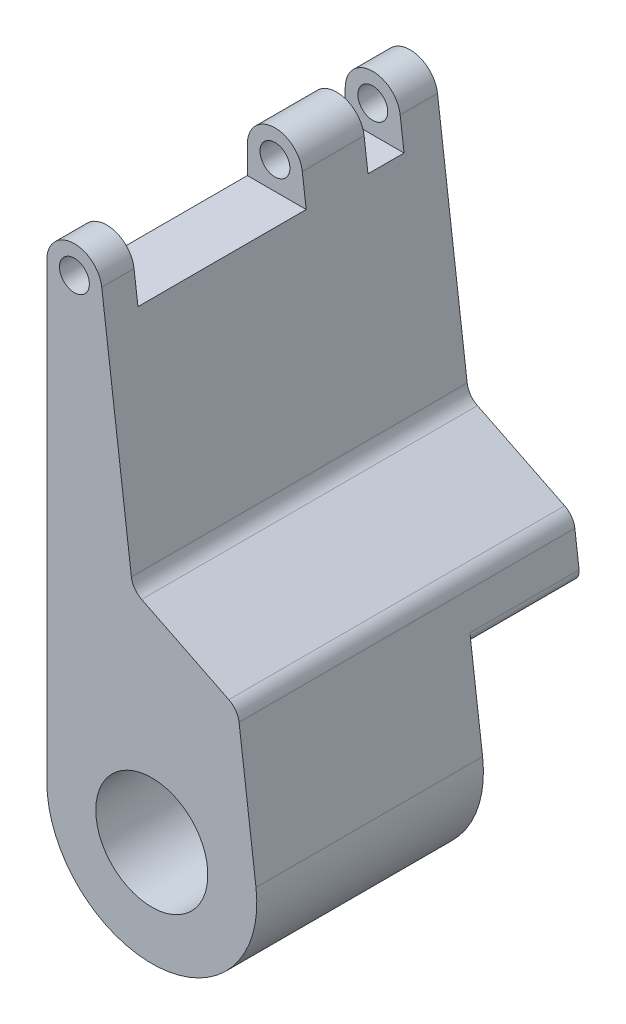
ISO-10303-21;
HEADER;
FILE_DESCRIPTION(('STEP AP214'),'2;1');
FILE_NAME('part.step','',(''),(''),'','','');
FILE_SCHEMA(('AUTOMOTIVE_DESIGN { 1 0 10303 214 1 1 1 1 }'));
ENDSEC;
DATA;
#1=APPLICATION_CONTEXT('core data for automotive mechanical design processes');
#2=APPLICATION_PROTOCOL_DEFINITION('international standard','automotive_design',2000,#1);
#3=PRODUCT_CONTEXT('',#1,'mechanical');
#4=PRODUCT('Part','Part','',(#3));
#5=PRODUCT_RELATED_PRODUCT_CATEGORY('part','',(#4));
#6=PRODUCT_DEFINITION_FORMATION('','',#4);
#7=PRODUCT_DEFINITION_CONTEXT('part definition',#1,'design');
#8=PRODUCT_DEFINITION('design','',#6,#7);
#9=PRODUCT_DEFINITION_SHAPE('','',#8);
#10=(LENGTH_UNIT() NAMED_UNIT(*) SI_UNIT(.MILLI.,.METRE.));
#11=(NAMED_UNIT(*) PLANE_ANGLE_UNIT() SI_UNIT($,.RADIAN.));
#12=(NAMED_UNIT(*) SI_UNIT($,.STERADIAN.) SOLID_ANGLE_UNIT());
#13=UNCERTAINTY_MEASURE_WITH_UNIT(LENGTH_MEASURE(1.E-05),#10,'distance_accuracy_value','');
#14=(GEOMETRIC_REPRESENTATION_CONTEXT(3) GLOBAL_UNCERTAINTY_ASSIGNED_CONTEXT((#13)) GLOBAL_UNIT_ASSIGNED_CONTEXT((#10,
#11,#12)) REPRESENTATION_CONTEXT('',''));
#15=CARTESIAN_POINT('',(0.,0.,0.));
#16=DIRECTION('',(0.,0.,1.));
#17=DIRECTION('',(1.,0.,0.));
#18=AXIS2_PLACEMENT_3D('',#15,#16,#17);
#19=CARTESIAN_POINT('',(-5.26423151931798,30.7536546615097,15.4071087170799));
#20=DIRECTION('',(0.,0.,-1.));
#21=DIRECTION('',(-1.,0.,0.));
#22=AXIS2_PLACEMENT_3D('',#19,#20,#21);
#23=CYLINDRICAL_SURFACE('',#22,1.87429142322228);
#24=DIRECTION('',(0.,0.,-1.));
#25=VECTOR('',#24,1.);
#26=CARTESIAN_POINT('',(-7.13852294254025,30.7536546615097,15.4071087170799));
#27=LINE('',#26,#25);
#28=CARTESIAN_POINT('',(-7.13852294254025,30.7536546615097,1.77089277270113));
#29=VERTEX_POINT('',#28);
#30=CARTESIAN_POINT('',(-7.13852294254025,30.7536546615097,-2.43096537754614));
#31=VERTEX_POINT('',#30);
#32=EDGE_CURVE('E338',#29,#31,#27,.T.);
#33=ORIENTED_EDGE('',*,*,#32,.F.);
#34=CARTESIAN_POINT('',(-5.26423151931798,30.7536546615097,1.77089277270113));
#35=DIRECTION('',(0.,0.,-1.));
#36=DIRECTION('',(-1.,0.,0.));
#37=AXIS2_PLACEMENT_3D('',#34,#35,#36);
#38=CIRCLE('',#37,1.87429142322228);
#39=CARTESIAN_POINT('',(-3.4045610483609,30.9873084194827,1.77089277270113));
#40=VERTEX_POINT('',#39);
#41=EDGE_CURVE('E181',#29,#40,#38,.T.);
#42=ORIENTED_EDGE('',*,*,#41,.T.);
#43=DIRECTION('',(0.,0.,-1.));
#44=VECTOR('',#43,1.);
#45=CARTESIAN_POINT('',(-3.4045610483609,30.9873084194827,15.4071087170799));
#46=LINE('',#45,#44);
#47=CARTESIAN_POINT('',(-3.4045610483609,30.9873084194827,-2.43096537754614));
#48=VERTEX_POINT('',#47);
#49=EDGE_CURVE('E364',#40,#48,#46,.T.);
#50=ORIENTED_EDGE('',*,*,#49,.T.);
#51=CARTESIAN_POINT('',(-5.26423151931798,30.7536546615097,-2.43096537754614));
#52=DIRECTION('',(0.,0.,1.));
#53=DIRECTION('',(1.,0.,0.));
#54=AXIS2_PLACEMENT_3D('',#51,#52,#53);
#55=CIRCLE('',#54,1.87429142322228);
#56=EDGE_CURVE('E217',#48,#31,#55,.T.);
#57=ORIENTED_EDGE('',*,*,#56,.T.);
#58=EDGE_LOOP('',(#33,#42,#50,#57));
#59=FACE_BOUND('',#58,.T.);
#60=ADVANCED_FACE('F32',(#59),#23,.T.);
#61=CARTESIAN_POINT('',(-5.26423151931798,30.7536546615097,15.4071087170799));
#62=DIRECTION('',(0.,0.,-1.));
#63=DIRECTION('',(-1.,0.,0.));
#64=AXIS2_PLACEMENT_3D('',#61,#62,#63);
#65=CYLINDRICAL_SURFACE('',#64,1.016);
#66=CARTESIAN_POINT('',(-5.26423151931798,30.7536546615097,1.77089277270113));
#67=DIRECTION('',(0.,0.,-1.));
#68=DIRECTION('',(-1.,0.,0.));
#69=AXIS2_PLACEMENT_3D('',#66,#67,#68);
#70=CIRCLE('',#69,1.016);
#71=CARTESIAN_POINT('',(-6.28023151931798,30.7536546615097,1.77089277270113));
#72=VERTEX_POINT('',#71);
#73=EDGE_CURVE('E198',#72,#72,#70,.F.);
#74=ORIENTED_EDGE('',*,*,#73,.T.);
#75=EDGE_LOOP('',(#74));
#76=FACE_BOUND('',#75,.T.);
#77=CARTESIAN_POINT('',(-5.26423151931798,30.7536546615097,-2.43096537754614));
#78=DIRECTION('',(0.,0.,1.));
#79=DIRECTION('',(1.,0.,0.));
#80=AXIS2_PLACEMENT_3D('',#77,#78,#79);
#81=CIRCLE('',#80,1.016);
#82=CARTESIAN_POINT('',(-4.24823151931798,30.7536546615097,-2.43096537754614));
#83=VERTEX_POINT('',#82);
#84=EDGE_CURVE('E212',#83,#83,#81,.F.);
#85=ORIENTED_EDGE('',*,*,#84,.T.);
#86=EDGE_LOOP('',(#85));
#87=FACE_BOUND('',#86,.T.);
#88=ADVANCED_FACE('F295',(#76,#87),#65,.F.);
#89=CARTESIAN_POINT('',(-7.13852294254025,30.7536546615097,-4.88287033483759));
#90=VERTEX_POINT('',#89);
#91=CARTESIAN_POINT('',(-7.13852294254025,30.7536546615097,-7.42287033483759));
#92=VERTEX_POINT('',#91);
#93=EDGE_CURVE('E340',#90,#92,#27,.T.);
#94=ORIENTED_EDGE('',*,*,#93,.F.);
#95=CARTESIAN_POINT('',(-5.26423151931798,30.7536546615097,-4.88287033483759));
#96=DIRECTION('',(0.,0.,-1.));
#97=DIRECTION('',(-1.,0.,0.));
#98=AXIS2_PLACEMENT_3D('',#95,#96,#97);
#99=CIRCLE('',#98,1.87429142322228);
#100=CARTESIAN_POINT('',(-3.4045610483609,30.9873084194827,-4.88287033483759));
#101=VERTEX_POINT('',#100);
#102=EDGE_CURVE('E224',#90,#101,#99,.T.);
#103=ORIENTED_EDGE('',*,*,#102,.T.);
#104=CARTESIAN_POINT('',(-3.4045610483609,30.9873084194827,-7.42287033483759));
#105=VERTEX_POINT('',#104);
#106=EDGE_CURVE('E365',#101,#105,#46,.T.);
#107=ORIENTED_EDGE('',*,*,#106,.T.);
#108=CARTESIAN_POINT('',(-5.26423151931798,30.7536546615097,-7.42287033483759));
#109=DIRECTION('',(0.,0.,-1.));
#110=DIRECTION('',(-1.,0.,0.));
#111=AXIS2_PLACEMENT_3D('',#108,#109,#110);
#112=CIRCLE('',#111,1.87429142322228);
#113=EDGE_CURVE('E260',#92,#105,#112,.T.);
#114=ORIENTED_EDGE('',*,*,#113,.F.);
#115=EDGE_LOOP('',(#94,#103,#107,#114));
#116=FACE_BOUND('',#115,.T.);
#117=ADVANCED_FACE('F312',(#116),#23,.T.);
#118=CARTESIAN_POINT('',(-5.26423151931798,30.7536546615097,-4.88287033483759));
#119=DIRECTION('',(0.,0.,-1.));
#120=DIRECTION('',(-1.,0.,0.));
#121=AXIS2_PLACEMENT_3D('',#118,#119,#120);
#122=CIRCLE('',#121,1.016);
#123=CARTESIAN_POINT('',(-6.28023151931798,30.7536546615097,-4.88287033483759));
#124=VERTEX_POINT('',#123);
#125=EDGE_CURVE('E220',#124,#124,#122,.F.);
#126=ORIENTED_EDGE('',*,*,#125,.T.);
#127=EDGE_LOOP('',(#126));
#128=FACE_BOUND('',#127,.T.);
#129=CARTESIAN_POINT('',(-5.26423151931798,30.7536546615097,-7.42287033483759));
#130=DIRECTION('',(0.,0.,-1.));
#131=DIRECTION('',(-1.,0.,0.));
#132=AXIS2_PLACEMENT_3D('',#129,#130,#131);
#133=CIRCLE('',#132,1.016);
#134=CARTESIAN_POINT('',(-6.28023151931798,30.7536546615097,-7.42287033483759));
#135=VERTEX_POINT('',#134);
#136=EDGE_CURVE('E226',#135,#135,#133,.T.);
#137=ORIENTED_EDGE('',*,*,#136,.T.);
#138=EDGE_LOOP('',(#137));
#139=FACE_BOUND('',#138,.T.);
#140=ADVANCED_FACE('F317',(#128,#139),#65,.F.);
#141=CARTESIAN_POINT('',(-5.26423151931798,30.7536546615097,13.2092844039298));
#142=DIRECTION('',(0.,0.,1.));
#143=DIRECTION('',(1.,0.,0.));
#144=AXIS2_PLACEMENT_3D('',#141,#142,#143);
#145=CIRCLE('',#144,1.87429142322228);
#146=CARTESIAN_POINT('',(-3.4045610483609,30.9873084194827,13.2092844039298));
#147=VERTEX_POINT('',#146);
#148=CARTESIAN_POINT('',(-7.13852294254025,30.7536546615097,13.2092844039298));
#149=VERTEX_POINT('',#148);
#150=EDGE_CURVE('E196',#147,#149,#145,.T.);
#151=ORIENTED_EDGE('',*,*,#150,.T.);
#152=CARTESIAN_POINT('',(-7.13852294254025,30.7536546615097,15.4071087170799));
#153=VERTEX_POINT('',#152);
#154=EDGE_CURVE('E290',#153,#149,#27,.T.);
#155=ORIENTED_EDGE('',*,*,#154,.F.);
#156=CARTESIAN_POINT('',(-5.26423151931798,30.7536546615097,15.4071087170799));
#157=DIRECTION('',(0.,0.,1.));
#158=DIRECTION('',(-1.,0.,0.));
#159=AXIS2_PLACEMENT_3D('',#156,#157,#158);
#160=CIRCLE('',#159,1.87429142322228);
#161=CARTESIAN_POINT('',(-3.4045610483609,30.9873084194827,15.4071087170799));
#162=VERTEX_POINT('',#161);
#163=EDGE_CURVE('E373',#162,#153,#160,.T.);
#164=ORIENTED_EDGE('',*,*,#163,.F.);
#165=EDGE_CURVE('E333',#162,#147,#46,.T.);
#166=ORIENTED_EDGE('',*,*,#165,.T.);
#167=EDGE_LOOP('',(#151,#155,#164,#166));
#168=FACE_BOUND('',#167,.T.);
#169=ADVANCED_FACE('F34',(#168),#23,.T.);
#170=CARTESIAN_POINT('',(-7.13852294254025,30.7536546615097,15.4071087170799));
#171=DIRECTION('',(1.,0.,0.));
#172=DIRECTION('',(0.,1.,0.));
#173=AXIS2_PLACEMENT_3D('',#170,#171,#172);
#174=PLANE('',#173);
#175=DIRECTION('',(0.,0.,1.));
#176=VECTOR('',#175,1.);
#177=CARTESIAN_POINT('',(-7.13852294254025,28.8793632382874,1.77089277270113));
#178=LINE('',#177,#176);
#179=CARTESIAN_POINT('',(-7.13852294254025,28.8793632382874,1.77089277270113));
#180=VERTEX_POINT('',#179);
#181=CARTESIAN_POINT('',(-7.13852294254025,28.8793632382874,13.2092844039298));
#182=VERTEX_POINT('',#181);
#183=EDGE_CURVE('E171',#180,#182,#178,.T.);
#184=ORIENTED_EDGE('',*,*,#183,.F.);
#185=DIRECTION('',(0.,-1.,0.));
#186=VECTOR('',#185,1.);
#187=CARTESIAN_POINT('',(-7.13852294254025,32.627946084732,1.77089277270113));
#188=LINE('',#187,#186);
#189=EDGE_CURVE('E179',#29,#180,#188,.T.);
#190=ORIENTED_EDGE('',*,*,#189,.F.);
#191=ORIENTED_EDGE('',*,*,#32,.T.);
#192=DIRECTION('',(0.,1.,0.));
#193=VECTOR('',#192,1.);
#194=CARTESIAN_POINT('',(-7.13852294254025,32.627946084732,-2.43096537754614));
#195=LINE('',#194,#193);
#196=CARTESIAN_POINT('',(-7.13852294254025,28.8793632382874,-2.43096537754614));
#197=VERTEX_POINT('',#196);
#198=EDGE_CURVE('E207',#197,#31,#195,.T.);
#199=ORIENTED_EDGE('',*,*,#198,.F.);
#200=DIRECTION('',(0.,0.,1.));
#201=VECTOR('',#200,1.);
#202=CARTESIAN_POINT('',(-7.13852294254025,28.8793632382874,-4.88287033483759));
#203=LINE('',#202,#201);
#204=CARTESIAN_POINT('',(-7.13852294254025,28.8793632382874,-4.88287033483759));
#205=VERTEX_POINT('',#204);
#206=EDGE_CURVE('E205',#205,#197,#203,.T.);
#207=ORIENTED_EDGE('',*,*,#206,.F.);
#208=DIRECTION('',(0.,-1.,0.));
#209=VECTOR('',#208,1.);
#210=CARTESIAN_POINT('',(-7.13852294254025,32.627946084732,-4.88287033483759));
#211=LINE('',#210,#209);
#212=EDGE_CURVE('E202',#90,#205,#211,.T.);
#213=ORIENTED_EDGE('',*,*,#212,.F.);
#214=ORIENTED_EDGE('',*,*,#93,.T.);
#215=DIRECTION('',(0.,1.,0.));
#216=VECTOR('',#215,1.);
#217=CARTESIAN_POINT('',(-7.13852294254025,30.7536546615097,-7.42287033483759));
#218=LINE('',#217,#216);
#219=CARTESIAN_POINT('',(-7.13852294254025,8.46777122343728,-7.42287033483759));
#220=VERTEX_POINT('',#219);
#221=EDGE_CURVE('E257',#220,#92,#218,.T.);
#222=ORIENTED_EDGE('',*,*,#221,.F.);
#223=DIRECTION('',(0.,0.,1.));
#224=VECTOR('',#223,1.);
#225=CARTESIAN_POINT('',(-7.13852294254025,8.46777122343728,-7.42287033483759));
#226=LINE('',#225,#224);
#227=CARTESIAN_POINT('',(-7.13852294254025,8.46777122343728,0.));
#228=VERTEX_POINT('',#227);
#229=EDGE_CURVE('E266',#220,#228,#226,.T.);
#230=ORIENTED_EDGE('',*,*,#229,.T.);
#231=DIRECTION('',(0.,-1.,0.));
#232=VECTOR('',#231,1.);
#233=CARTESIAN_POINT('',(-7.13852294254025,30.7536546615097,0.));
#234=LINE('',#233,#232);
#235=CARTESIAN_POINT('',(-7.13852294254025,0.,0.));
#236=VERTEX_POINT('',#235);
#237=EDGE_CURVE('E374',#228,#236,#234,.T.);
#238=ORIENTED_EDGE('',*,*,#237,.T.);
#239=DIRECTION('',(0.,0.,-1.));
#240=VECTOR('',#239,1.);
#241=CARTESIAN_POINT('',(-7.13852294254025,0.,15.4071087170799));
#242=LINE('',#241,#240);
#243=CARTESIAN_POINT('',(-7.13852294254025,0.,15.4071087170799));
#244=VERTEX_POINT('',#243);
#245=EDGE_CURVE('E343',#244,#236,#242,.T.);
#246=ORIENTED_EDGE('',*,*,#245,.F.);
#247=DIRECTION('',(0.,-1.,0.));
#248=VECTOR('',#247,1.);
#249=CARTESIAN_POINT('',(-7.13852294254025,30.7536546615097,15.4071087170799));
#250=LINE('',#249,#248);
#251=EDGE_CURVE('E336',#153,#244,#250,.T.);
#252=ORIENTED_EDGE('',*,*,#251,.F.);
#253=ORIENTED_EDGE('',*,*,#154,.T.);
#254=DIRECTION('',(0.,1.,0.));
#255=VECTOR('',#254,1.);
#256=CARTESIAN_POINT('',(-7.13852294254025,32.627946084732,13.2092844039298));
#257=LINE('',#256,#255);
#258=EDGE_CURVE('E176',#182,#149,#257,.T.);
#259=ORIENTED_EDGE('',*,*,#258,.F.);
#260=EDGE_LOOP('',(#184,#190,#191,#199,#207,#213,#214,#222,#230,#238,#246,#252,#253,#259));
#261=FACE_BOUND('',#260,.T.);
#262=ADVANCED_FACE('F185',(#261),#174,.F.);
#263=CARTESIAN_POINT('',(0.,0.,15.4071087170799));
#264=DIRECTION('',(0.,0.,-1.));
#265=DIRECTION('',(-1.,0.,0.));
#266=AXIS2_PLACEMENT_3D('',#263,#264,#265);
#267=CYLINDRICAL_SURFACE('',#266,7.13852294254024);
#268=CARTESIAN_POINT('',(0.,0.,0.));
#269=DIRECTION('',(0.,0.,1.));
#270=DIRECTION('',(1.,0.,0.));
#271=AXIS2_PLACEMENT_3D('',#268,#269,#270);
#272=CIRCLE('',#271,7.13852294254024);
#273=CARTESIAN_POINT('',(7.0828368299679,0.889905748505836,0.));
#274=VERTEX_POINT('',#273);
#275=EDGE_CURVE('E368',#236,#274,#272,.T.);
#276=ORIENTED_EDGE('',*,*,#275,.T.);
#277=DIRECTION('',(0.,0.,-1.));
#278=VECTOR('',#277,1.);
#279=CARTESIAN_POINT('',(7.0828368299679,0.889905748505836,15.4071087170799));
#280=LINE('',#279,#278);
#281=CARTESIAN_POINT('',(7.0828368299679,0.889905748505836,15.4071087170799));
#282=VERTEX_POINT('',#281);
#283=EDGE_CURVE('E348',#282,#274,#280,.T.);
#284=ORIENTED_EDGE('',*,*,#283,.F.);
#285=CARTESIAN_POINT('',(0.,0.,15.4071087170799));
#286=DIRECTION('',(0.,0.,1.));
#287=DIRECTION('',(1.,0.,0.));
#288=AXIS2_PLACEMENT_3D('',#285,#286,#287);
#289=CIRCLE('',#288,7.13852294254024);
#290=EDGE_CURVE('E390',#244,#282,#289,.T.);
#291=ORIENTED_EDGE('',*,*,#290,.F.);
#292=ORIENTED_EDGE('',*,*,#245,.T.);
#293=EDGE_LOOP('',(#276,#284,#291,#292));
#294=FACE_BOUND('',#293,.T.);
#295=ADVANCED_FACE('F327',(#294),#267,.T.);
#296=CARTESIAN_POINT('',(5.93230180711235,10.0471135176787,15.4071087170799));
#297=DIRECTION('',(-0.992199210814257,-0.124662448474132,0.));
#298=DIRECTION('',(0.124662448474132,-0.992199210814257,0.));
#299=AXIS2_PLACEMENT_3D('',#296,#297,#298);
#300=PLANE('',#299);
#301=DIRECTION('',(-0.124662448474132,0.992199210814257,0.));
#302=VECTOR('',#301,1.);
#303=CARTESIAN_POINT('',(5.93230180711235,10.0471135176787,0.));
#304=LINE('',#303,#302);
#305=CARTESIAN_POINT('',(6.22068078858034,7.75188025914596,0.));
#306=VERTEX_POINT('',#305);
#307=EDGE_CURVE('E370',#274,#306,#304,.T.);
#308=ORIENTED_EDGE('',*,*,#307,.T.);
#309=DIRECTION('',(0.,0.,1.));
#310=VECTOR('',#309,1.);
#311=CARTESIAN_POINT('',(6.22068078858034,7.75188025914596,-7.42287033483759));
#312=LINE('',#311,#310);
#313=CARTESIAN_POINT('',(6.22068078858034,7.75188025914596,-7.42287033483759));
#314=VERTEX_POINT('',#313);
#315=EDGE_CURVE('E376',#314,#306,#312,.T.);
#316=ORIENTED_EDGE('',*,*,#315,.F.);
#317=DIRECTION('',(0.124662448474133,-0.992199210814257,0.));
#318=VECTOR('',#317,1.);
#319=CARTESIAN_POINT('',(6.22068078858034,7.75188025914596,-7.42287033483759));
#320=LINE('',#319,#318);
#321=CARTESIAN_POINT('',(5.93230180711235,10.0471135176787,-7.42287033483759));
#322=VERTEX_POINT('',#321);
#323=EDGE_CURVE('E249',#322,#314,#320,.T.);
#324=ORIENTED_EDGE('',*,*,#323,.F.);
#325=DIRECTION('',(0.,0.,-1.));
#326=VECTOR('',#325,1.);
#327=CARTESIAN_POINT('',(5.93230180711235,10.0471135176787,15.4071087170799));
#328=LINE('',#327,#326);
#329=CARTESIAN_POINT('',(5.93230180711235,10.0471135176787,15.4071087170799));
#330=VERTEX_POINT('',#329);
#331=EDGE_CURVE('E353',#330,#322,#328,.T.);
#332=ORIENTED_EDGE('',*,*,#331,.F.);
#333=DIRECTION('',(-0.124662448474132,0.992199210814257,0.));
#334=VECTOR('',#333,1.);
#335=CARTESIAN_POINT('',(5.93230180711235,10.0471135176787,15.4071087170799));
#336=LINE('',#335,#334);
#337=EDGE_CURVE('E388',#282,#330,#336,.T.);
#338=ORIENTED_EDGE('',*,*,#337,.F.);
#339=ORIENTED_EDGE('',*,*,#283,.T.);
#340=EDGE_LOOP('',(#308,#316,#324,#332,#338,#339));
#341=FACE_BOUND('',#340,.T.);
#342=ADVANCED_FACE('F416',(#341),#300,.F.);
#343=CARTESIAN_POINT('',(4.67220880937825,9.88879220811653,15.4071087170799));
#344=DIRECTION('',(0.,0.,-1.));
#345=DIRECTION('',(-1.,0.,0.));
#346=AXIS2_PLACEMENT_3D('',#343,#344,#345);
#347=CYLINDRICAL_SURFACE('',#346,1.27);
#348=ORIENTED_EDGE('',*,*,#331,.T.);
#349=CARTESIAN_POINT('',(4.67220880937825,9.88879220811653,-7.42287033483759));
#350=DIRECTION('',(0.,0.,-1.));
#351=DIRECTION('',(-1.,0.,0.));
#352=AXIS2_PLACEMENT_3D('',#349,#350,#351);
#353=CIRCLE('',#352,1.27);
#354=CARTESIAN_POINT('',(5.2357426456384,11.0269176912641,-7.42287033483759));
#355=VERTEX_POINT('',#354);
#356=EDGE_CURVE('E246',#355,#322,#353,.T.);
#357=ORIENTED_EDGE('',*,*,#356,.F.);
#358=DIRECTION('',(0.,0.,-1.));
#359=VECTOR('',#358,1.);
#360=CARTESIAN_POINT('',(5.2357426456384,11.0269176912641,15.4071087170799));
#361=LINE('',#360,#359);
#362=CARTESIAN_POINT('',(5.2357426456384,11.0269176912641,15.4071087170799));
#363=VERTEX_POINT('',#362);
#364=EDGE_CURVE('E357',#363,#355,#361,.T.);
#365=ORIENTED_EDGE('',*,*,#364,.F.);
#366=CARTESIAN_POINT('',(4.67220880937825,9.88879220811653,15.4071087170799));
#367=DIRECTION('',(0.,0.,1.));
#368=DIRECTION('',(-1.,0.,0.));
#369=AXIS2_PLACEMENT_3D('',#366,#367,#368);
#370=CIRCLE('',#369,1.27);
#371=EDGE_CURVE('E386',#330,#363,#370,.T.);
#372=ORIENTED_EDGE('',*,*,#371,.F.);
#373=EDGE_LOOP('',(#348,#357,#365,#372));
#374=FACE_BOUND('',#373,.T.);
#375=ADVANCED_FACE('F482',(#374),#347,.T.);
#376=CARTESIAN_POINT('',(-0.692002915618578,13.9619940479334,15.4071087170799));
#377=DIRECTION('',(-0.443727430126103,-0.896161797754002,0.));
#378=DIRECTION('',(0.896161797754002,-0.443727430126103,0.));
#379=AXIS2_PLACEMENT_3D('',#376,#377,#378);
#380=PLANE('',#379);
#381=ORIENTED_EDGE('',*,*,#364,.T.);
#382=DIRECTION('',(0.896161797754002,-0.443727430126103,0.));
#383=VECTOR('',#382,1.);
#384=CARTESIAN_POINT('',(5.2357426456384,11.0269176912641,-7.42287033483759));
#385=LINE('',#384,#383);
#386=CARTESIAN_POINT('',(-0.692002915618578,13.9619940479334,-7.42287033483759));
#387=VERTEX_POINT('',#386);
#388=EDGE_CURVE('E242',#387,#355,#385,.T.);
#389=ORIENTED_EDGE('',*,*,#388,.F.);
#390=DIRECTION('',(0.,0.,-1.));
#391=VECTOR('',#390,1.);
#392=CARTESIAN_POINT('',(-0.692002915618578,13.9619940479334,15.4071087170799));
#393=LINE('',#392,#391);
#394=CARTESIAN_POINT('',(-0.692002915618578,13.9619940479334,15.4071087170799));
#395=VERTEX_POINT('',#394);
#396=EDGE_CURVE('E359',#395,#387,#393,.T.);
#397=ORIENTED_EDGE('',*,*,#396,.F.);
#398=DIRECTION('',(-0.896161797754002,0.443727430126103,0.));
#399=VECTOR('',#398,1.);
#400=CARTESIAN_POINT('',(-0.692002915618578,13.9619940479334,15.4071087170799));
#401=LINE('',#400,#399);
#402=EDGE_CURVE('E384',#363,#395,#401,.T.);
#403=ORIENTED_EDGE('',*,*,#402,.F.);
#404=EDGE_LOOP('',(#381,#389,#397,#403));
#405=FACE_BOUND('',#404,.T.);
#406=ADVANCED_FACE('F478',(#405),#380,.F.);
#407=CARTESIAN_POINT('',(-0.128469079358427,15.1001195310809,15.4071087170799));
#408=DIRECTION('',(0.,0.,-1.));
#409=DIRECTION('',(-1.,0.,0.));
#410=AXIS2_PLACEMENT_3D('',#407,#408,#409);
#411=CYLINDRICAL_SURFACE('',#410,1.27);
#412=ORIENTED_EDGE('',*,*,#396,.T.);
#413=CARTESIAN_POINT('',(-0.128469079358427,15.1001195310809,-7.42287033483759));
#414=DIRECTION('',(0.,0.,1.));
#415=DIRECTION('',(-1.,0.,0.));
#416=AXIS2_PLACEMENT_3D('',#413,#414,#415);
#417=CIRCLE('',#416,1.27);
#418=CARTESIAN_POINT('',(-1.38856207709253,14.9417982215188,-7.42287033483759));
#419=VERTEX_POINT('',#418);
#420=EDGE_CURVE('E239',#419,#387,#417,.T.);
#421=ORIENTED_EDGE('',*,*,#420,.F.);
#422=DIRECTION('',(0.,0.,-1.));
#423=VECTOR('',#422,1.);
#424=CARTESIAN_POINT('',(-1.38856207709253,14.9417982215188,15.4071087170799));
#425=LINE('',#424,#423);
#426=CARTESIAN_POINT('',(-1.38856207709253,14.9417982215188,15.4071087170799));
#427=VERTEX_POINT('',#426);
#428=EDGE_CURVE('E361',#427,#419,#425,.T.);
#429=ORIENTED_EDGE('',*,*,#428,.F.);
#430=CARTESIAN_POINT('',(-0.128469079358427,15.1001195310809,15.4071087170799));
#431=DIRECTION('',(0.,0.,-1.));
#432=DIRECTION('',(1.,0.,0.));
#433=AXIS2_PLACEMENT_3D('',#430,#431,#432);
#434=CIRCLE('',#433,1.27);
#435=EDGE_CURVE('E382',#395,#427,#434,.T.);
#436=ORIENTED_EDGE('',*,*,#435,.F.);
#437=EDGE_LOOP('',(#412,#421,#429,#436));
#438=FACE_BOUND('',#437,.T.);
#439=ADVANCED_FACE('F475',(#438),#411,.F.);
#440=CARTESIAN_POINT('',(-1.38856207709253,14.9417982215188,15.4071087170799));
#441=DIRECTION('',(-0.992199210814257,-0.124662448474132,0.));
#442=DIRECTION('',(0.124662448474132,-0.992199210814257,0.));
#443=AXIS2_PLACEMENT_3D('',#440,#441,#442);
#444=PLANE('',#443);
#445=ORIENTED_EDGE('',*,*,#49,.F.);
#446=DIRECTION('',(0.124662448474132,-0.992199210814257,0.));
#447=VECTOR('',#446,1.);
#448=CARTESIAN_POINT('',(-1.38856207709253,14.9417982215188,1.77089277270113));
#449=LINE('',#448,#447);
#450=CARTESIAN_POINT('',(-3.1397134203111,28.8793632382874,1.77089277270113));
#451=VERTEX_POINT('',#450);
#452=EDGE_CURVE('E199',#40,#451,#449,.T.);
#453=ORIENTED_EDGE('',*,*,#452,.T.);
#454=DIRECTION('',(0.,0.,1.));
#455=VECTOR('',#454,1.);
#456=CARTESIAN_POINT('',(-3.1397134203111,28.8793632382874,15.4071087170799));
#457=LINE('',#456,#455);
#458=CARTESIAN_POINT('',(-3.1397134203111,28.8793632382874,13.2092844039298));
#459=VERTEX_POINT('',#458);
#460=EDGE_CURVE('E11',#451,#459,#457,.T.);
#461=ORIENTED_EDGE('',*,*,#460,.T.);
#462=DIRECTION('',(-0.124662448474132,0.992199210814257,0.));
#463=VECTOR('',#462,1.);
#464=CARTESIAN_POINT('',(-1.38856207709253,14.9417982215188,13.2092844039298));
#465=LINE('',#464,#463);
#466=EDGE_CURVE('E193',#459,#147,#465,.T.);
#467=ORIENTED_EDGE('',*,*,#466,.T.);
#468=ORIENTED_EDGE('',*,*,#165,.F.);
#469=DIRECTION('',(-0.124662448474132,0.992199210814257,0.));
#470=VECTOR('',#469,1.);
#471=CARTESIAN_POINT('',(-1.38856207709253,14.9417982215188,15.4071087170799));
#472=LINE('',#471,#470);
#473=EDGE_CURVE('E380',#427,#162,#472,.T.);
#474=ORIENTED_EDGE('',*,*,#473,.F.);
#475=ORIENTED_EDGE('',*,*,#428,.T.);
#476=DIRECTION('',(0.124662448474132,-0.992199210814257,0.));
#477=VECTOR('',#476,1.);
#478=CARTESIAN_POINT('',(-1.38856207709253,14.9417982215188,-7.42287033483759));
#479=LINE('',#478,#477);
#480=EDGE_CURVE('E263',#105,#419,#479,.T.);
#481=ORIENTED_EDGE('',*,*,#480,.F.);
#482=ORIENTED_EDGE('',*,*,#106,.F.);
#483=DIRECTION('',(0.124662448474132,-0.992199210814257,0.));
#484=VECTOR('',#483,1.);
#485=CARTESIAN_POINT('',(-1.38856207709253,14.9417982215188,-4.88287033483759));
#486=LINE('',#485,#484);
#487=CARTESIAN_POINT('',(-3.1397134203111,28.8793632382874,-4.88287033483759));
#488=VERTEX_POINT('',#487);
#489=EDGE_CURVE('E221',#101,#488,#486,.T.);
#490=ORIENTED_EDGE('',*,*,#489,.T.);
#491=DIRECTION('',(0.,0.,1.));
#492=VECTOR('',#491,1.);
#493=CARTESIAN_POINT('',(-3.1397134203111,28.8793632382874,15.4071087170799));
#494=LINE('',#493,#492);
#495=CARTESIAN_POINT('',(-3.1397134203111,28.8793632382874,-2.43096537754614));
#496=VERTEX_POINT('',#495);
#497=EDGE_CURVE('E40',#488,#496,#494,.T.);
#498=ORIENTED_EDGE('',*,*,#497,.T.);
#499=DIRECTION('',(-0.124662448474132,0.992199210814257,0.));
#500=VECTOR('',#499,1.);
#501=CARTESIAN_POINT('',(-1.38856207709253,14.9417982215188,-2.43096537754614));
#502=LINE('',#501,#500);
#503=EDGE_CURVE('E214',#496,#48,#502,.T.);
#504=ORIENTED_EDGE('',*,*,#503,.T.);
#505=EDGE_LOOP('',(#445,#453,#461,#467,#468,#474,#475,#481,#482,#490,#498,#504));
#506=FACE_BOUND('',#505,.T.);
#507=ADVANCED_FACE('F435',(#506),#444,.F.);
#508=CARTESIAN_POINT('',(-5.26423151931798,30.7536546615097,15.4071087170799));
#509=DIRECTION('',(0.,0.,-1.));
#510=DIRECTION('',(-1.,0.,0.));
#511=AXIS2_PLACEMENT_3D('',#508,#509,#510);
#512=PLANE('',#511);
#513=CARTESIAN_POINT('',(-5.26423151931798,30.7536546615097,15.4071087170799));
#514=DIRECTION('',(0.,0.,-1.));
#515=DIRECTION('',(-1.,0.,0.));
#516=AXIS2_PLACEMENT_3D('',#513,#514,#515);
#517=CIRCLE('',#516,1.016);
#518=CARTESIAN_POINT('',(-6.28023151931798,30.7536546615097,15.4071087170799));
#519=VERTEX_POINT('',#518);
#520=EDGE_CURVE('E227',#519,#519,#517,.T.);
#521=ORIENTED_EDGE('',*,*,#520,.T.);
#522=EDGE_LOOP('',(#521));
#523=FACE_BOUND('',#522,.T.);
#524=CARTESIAN_POINT('',(0.,0.,15.4071087170799));
#525=DIRECTION('',(0.,0.,-1.));
#526=DIRECTION('',(-1.,0.,0.));
#527=AXIS2_PLACEMENT_3D('',#524,#525,#526);
#528=CIRCLE('',#527,3.81);
#529=CARTESIAN_POINT('',(-3.81,0.,15.4071087170799));
#530=VERTEX_POINT('',#529);
#531=EDGE_CURVE('E233',#530,#530,#528,.T.);
#532=ORIENTED_EDGE('',*,*,#531,.T.);
#533=EDGE_LOOP('',(#532));
#534=FACE_BOUND('',#533,.T.);
#535=ORIENTED_EDGE('',*,*,#163,.T.);
#536=ORIENTED_EDGE('',*,*,#251,.T.);
#537=ORIENTED_EDGE('',*,*,#290,.T.);
#538=ORIENTED_EDGE('',*,*,#337,.T.);
#539=ORIENTED_EDGE('',*,*,#371,.T.);
#540=ORIENTED_EDGE('',*,*,#402,.T.);
#541=ORIENTED_EDGE('',*,*,#435,.T.);
#542=ORIENTED_EDGE('',*,*,#473,.T.);
#543=EDGE_LOOP('',(#535,#536,#537,#538,#539,#540,#541,#542));
#544=FACE_BOUND('',#543,.T.);
#545=ADVANCED_FACE('F422',(#523,#534,#544),#512,.F.);
#546=CARTESIAN_POINT('',(-5.26423151931798,30.7536546615097,0.));
#547=DIRECTION('',(0.,0.,-1.));
#548=DIRECTION('',(-1.,0.,0.));
#549=AXIS2_PLACEMENT_3D('',#546,#547,#548);
#550=PLANE('',#549);
#551=CARTESIAN_POINT('',(0.,0.,0.));
#552=DIRECTION('',(0.,0.,-1.));
#553=DIRECTION('',(-1.,0.,0.));
#554=AXIS2_PLACEMENT_3D('',#551,#552,#553);
#555=CIRCLE('',#554,3.81);
#556=CARTESIAN_POINT('',(-3.81,0.,0.));
#557=VERTEX_POINT('',#556);
#558=EDGE_CURVE('E230',#557,#557,#555,.T.);
#559=ORIENTED_EDGE('',*,*,#558,.F.);
#560=EDGE_LOOP('',(#559));
#561=FACE_BOUND('',#560,.T.);
#562=CARTESIAN_POINT('',(-5.57569478768888,8.46777122343728,0.));
#563=DIRECTION('',(0.,0.,-1.));
#564=DIRECTION('',(-1.,0.,0.));
#565=AXIS2_PLACEMENT_3D('',#562,#563,#564);
#566=CIRCLE('',#565,1.56282815485138);
#567=CARTESIAN_POINT('',(-5.57569478768888,6.9049430685859,0.));
#568=VERTEX_POINT('',#567);
#569=EDGE_CURVE('E243',#568,#228,#566,.T.);
#570=ORIENTED_EDGE('',*,*,#569,.F.);
#571=DIRECTION('',(-1.,0.,0.));
#572=VECTOR('',#571,1.);
#573=CARTESIAN_POINT('',(-5.57569478768888,6.9049430685859,0.));
#574=LINE('',#573,#572);
#575=CARTESIAN_POINT('',(5.473496232696,6.9049430685859,0.));
#576=VERTEX_POINT('',#575);
#577=EDGE_CURVE('E267',#576,#568,#574,.T.);
#578=ORIENTED_EDGE('',*,*,#577,.F.);
#579=CARTESIAN_POINT('',(5.473496232696,7.65800207905533,0.));
#580=DIRECTION('',(0.,0.,-1.));
#581=DIRECTION('',(1.,0.,0.));
#582=AXIS2_PLACEMENT_3D('',#579,#580,#581);
#583=CIRCLE('',#582,0.753059010469431);
#584=EDGE_CURVE('E236',#306,#576,#583,.T.);
#585=ORIENTED_EDGE('',*,*,#584,.F.);
#586=ORIENTED_EDGE('',*,*,#307,.F.);
#587=ORIENTED_EDGE('',*,*,#275,.F.);
#588=ORIENTED_EDGE('',*,*,#237,.F.);
#589=EDGE_LOOP('',(#570,#578,#585,#586,#587,#588));
#590=FACE_BOUND('',#589,.T.);
#591=ADVANCED_FACE('F408',(#561,#590),#550,.T.);
#592=CARTESIAN_POINT('',(5.473496232696,7.65800207905533,-7.42287033483759));
#593=DIRECTION('',(0.,0.,1.));
#594=DIRECTION('',(1.,0.,0.));
#595=AXIS2_PLACEMENT_3D('',#592,#593,#594);
#596=CYLINDRICAL_SURFACE('',#595,0.753059010469431);
#597=ORIENTED_EDGE('',*,*,#584,.T.);
#598=DIRECTION('',(0.,0.,1.));
#599=VECTOR('',#598,1.);
#600=CARTESIAN_POINT('',(5.473496232696,6.9049430685859,-7.42287033483759));
#601=LINE('',#600,#599);
#602=CARTESIAN_POINT('',(5.473496232696,6.9049430685859,-7.42287033483759));
#603=VERTEX_POINT('',#602);
#604=EDGE_CURVE('E393',#603,#576,#601,.T.);
#605=ORIENTED_EDGE('',*,*,#604,.F.);
#606=CARTESIAN_POINT('',(5.473496232696,7.65800207905533,-7.42287033483759));
#607=DIRECTION('',(0.,0.,-1.));
#608=DIRECTION('',(1.,0.,0.));
#609=AXIS2_PLACEMENT_3D('',#606,#607,#608);
#610=CIRCLE('',#609,0.753059010469431);
#611=EDGE_CURVE('E251',#314,#603,#610,.T.);
#612=ORIENTED_EDGE('',*,*,#611,.F.);
#613=ORIENTED_EDGE('',*,*,#315,.T.);
#614=EDGE_LOOP('',(#597,#605,#612,#613));
#615=FACE_BOUND('',#614,.T.);
#616=ADVANCED_FACE('F411',(#615),#596,.T.);
#617=CARTESIAN_POINT('',(-5.57569478768888,6.9049430685859,-7.42287033483759));
#618=DIRECTION('',(0.,1.,0.));
#619=DIRECTION('',(-1.,0.,0.));
#620=AXIS2_PLACEMENT_3D('',#617,#618,#619);
#621=PLANE('',#620);
#622=ORIENTED_EDGE('',*,*,#577,.T.);
#623=DIRECTION('',(0.,0.,1.));
#624=VECTOR('',#623,1.);
#625=CARTESIAN_POINT('',(-5.57569478768888,6.9049430685859,-7.42287033483759));
#626=LINE('',#625,#624);
#627=CARTESIAN_POINT('',(-5.57569478768888,6.9049430685859,-7.42287033483759));
#628=VERTEX_POINT('',#627);
#629=EDGE_CURVE('E272',#628,#568,#626,.T.);
#630=ORIENTED_EDGE('',*,*,#629,.F.);
#631=DIRECTION('',(-1.,0.,0.));
#632=VECTOR('',#631,1.);
#633=CARTESIAN_POINT('',(-5.57569478768888,6.9049430685859,-7.42287033483759));
#634=LINE('',#633,#632);
#635=EDGE_CURVE('E253',#603,#628,#634,.T.);
#636=ORIENTED_EDGE('',*,*,#635,.F.);
#637=ORIENTED_EDGE('',*,*,#604,.T.);
#638=EDGE_LOOP('',(#622,#630,#636,#637));
#639=FACE_BOUND('',#638,.T.);
#640=ADVANCED_FACE('F405',(#639),#621,.F.);
#641=CARTESIAN_POINT('',(-5.57569478768888,8.46777122343728,-7.42287033483759));
#642=DIRECTION('',(0.,0.,1.));
#643=DIRECTION('',(1.,0.,0.));
#644=AXIS2_PLACEMENT_3D('',#641,#642,#643);
#645=CYLINDRICAL_SURFACE('',#644,1.56282815485138);
#646=ORIENTED_EDGE('',*,*,#569,.T.);
#647=ORIENTED_EDGE('',*,*,#229,.F.);
#648=CARTESIAN_POINT('',(-5.57569478768888,8.46777122343728,-7.42287033483759));
#649=DIRECTION('',(0.,0.,-1.));
#650=DIRECTION('',(-1.,0.,0.));
#651=AXIS2_PLACEMENT_3D('',#648,#649,#650);
#652=CIRCLE('',#651,1.56282815485138);
#653=EDGE_CURVE('E255',#628,#220,#652,.T.);
#654=ORIENTED_EDGE('',*,*,#653,.F.);
#655=ORIENTED_EDGE('',*,*,#629,.T.);
#656=EDGE_LOOP('',(#646,#647,#654,#655));
#657=FACE_BOUND('',#656,.T.);
#658=ADVANCED_FACE('F403',(#657),#645,.T.);
#659=CARTESIAN_POINT('',(-0.128469079358427,15.1001195310809,-7.42287033483759));
#660=DIRECTION('',(0.,0.,-1.));
#661=DIRECTION('',(-1.,0.,0.));
#662=AXIS2_PLACEMENT_3D('',#659,#660,#661);
#663=PLANE('',#662);
#664=ORIENTED_EDGE('',*,*,#136,.F.);
#665=EDGE_LOOP('',(#664));
#666=FACE_BOUND('',#665,.T.);
#667=ORIENTED_EDGE('',*,*,#420,.T.);
#668=ORIENTED_EDGE('',*,*,#388,.T.);
#669=ORIENTED_EDGE('',*,*,#356,.T.);
#670=ORIENTED_EDGE('',*,*,#323,.T.);
#671=ORIENTED_EDGE('',*,*,#611,.T.);
#672=ORIENTED_EDGE('',*,*,#635,.T.);
#673=ORIENTED_EDGE('',*,*,#653,.T.);
#674=ORIENTED_EDGE('',*,*,#221,.T.);
#675=ORIENTED_EDGE('',*,*,#113,.T.);
#676=ORIENTED_EDGE('',*,*,#480,.T.);
#677=EDGE_LOOP('',(#667,#668,#669,#670,#671,#672,#673,#674,#675,#676));
#678=FACE_BOUND('',#677,.T.);
#679=ADVANCED_FACE('F426',(#666,#678),#663,.T.);
#680=CARTESIAN_POINT('',(0.,0.,15.4071087170799));
#681=DIRECTION('',(0.,0.,-1.));
#682=DIRECTION('',(-1.,0.,0.));
#683=AXIS2_PLACEMENT_3D('',#680,#681,#682);
#684=CYLINDRICAL_SURFACE('',#683,3.81);
#685=ORIENTED_EDGE('',*,*,#531,.F.);
#686=EDGE_LOOP('',(#685));
#687=FACE_BOUND('',#686,.T.);
#688=ORIENTED_EDGE('',*,*,#558,.T.);
#689=EDGE_LOOP('',(#688));
#690=FACE_BOUND('',#689,.T.);
#691=ADVANCED_FACE('F453',(#687,#690),#684,.F.);
#692=CARTESIAN_POINT('',(-5.26423151931798,30.7536546615097,13.2092844039298));
#693=DIRECTION('',(0.,0.,1.));
#694=DIRECTION('',(1.,0.,0.));
#695=AXIS2_PLACEMENT_3D('',#692,#693,#694);
#696=CIRCLE('',#695,1.016);
#697=CARTESIAN_POINT('',(-4.24823151931798,30.7536546615097,13.2092844039298));
#698=VERTEX_POINT('',#697);
#699=EDGE_CURVE('E191',#698,#698,#696,.F.);
#700=ORIENTED_EDGE('',*,*,#699,.T.);
#701=EDGE_LOOP('',(#700));
#702=FACE_BOUND('',#701,.T.);
#703=ORIENTED_EDGE('',*,*,#520,.F.);
#704=EDGE_LOOP('',(#703));
#705=FACE_BOUND('',#704,.T.);
#706=ADVANCED_FACE('F318',(#702,#705),#65,.F.);
#707=CARTESIAN_POINT('',(7.13852294254024,28.8793632382874,-4.88287033483759));
#708=DIRECTION('',(0.,-1.,0.));
#709=DIRECTION('',(1.,0.,0.));
#710=AXIS2_PLACEMENT_3D('',#707,#708,#709);
#711=PLANE('',#710);
#712=DIRECTION('',(-1.,0.,0.));
#713=VECTOR('',#712,1.);
#714=CARTESIAN_POINT('',(7.13852294254024,28.8793632382874,-4.88287033483759));
#715=LINE('',#714,#713);
#716=EDGE_CURVE('E210',#488,#205,#715,.T.);
#717=ORIENTED_EDGE('',*,*,#716,.T.);
#718=ORIENTED_EDGE('',*,*,#206,.T.);
#719=DIRECTION('',(-1.,0.,0.));
#720=VECTOR('',#719,1.);
#721=CARTESIAN_POINT('',(7.13852294254024,28.8793632382874,-2.43096537754614));
#722=LINE('',#721,#720);
#723=EDGE_CURVE('E55',#496,#197,#722,.T.);
#724=ORIENTED_EDGE('',*,*,#723,.F.);
#725=ORIENTED_EDGE('',*,*,#497,.F.);
#726=EDGE_LOOP('',(#717,#718,#724,#725));
#727=FACE_BOUND('',#726,.T.);
#728=ADVANCED_FACE('F437',(#727),#711,.F.);
#729=CARTESIAN_POINT('',(7.13852294254024,32.627946084732,-4.88287033483759));
#730=DIRECTION('',(0.,0.,-1.));
#731=DIRECTION('',(-1.,0.,0.));
#732=AXIS2_PLACEMENT_3D('',#729,#730,#731);
#733=PLANE('',#732);
#734=ORIENTED_EDGE('',*,*,#125,.F.);
#735=EDGE_LOOP('',(#734));
#736=FACE_BOUND('',#735,.T.);
#737=ORIENTED_EDGE('',*,*,#212,.T.);
#738=ORIENTED_EDGE('',*,*,#716,.F.);
#739=ORIENTED_EDGE('',*,*,#489,.F.);
#740=ORIENTED_EDGE('',*,*,#102,.F.);
#741=EDGE_LOOP('',(#737,#738,#739,#740));
#742=FACE_BOUND('',#741,.T.);
#743=ADVANCED_FACE('F439',(#736,#742),#733,.F.);
#744=CARTESIAN_POINT('',(7.13852294254024,32.627946084732,-2.43096537754614));
#745=DIRECTION('',(0.,0.,1.));
#746=DIRECTION('',(1.,0.,0.));
#747=AXIS2_PLACEMENT_3D('',#744,#745,#746);
#748=PLANE('',#747);
#749=ORIENTED_EDGE('',*,*,#84,.F.);
#750=EDGE_LOOP('',(#749));
#751=FACE_BOUND('',#750,.T.);
#752=ORIENTED_EDGE('',*,*,#56,.F.);
#753=ORIENTED_EDGE('',*,*,#503,.F.);
#754=ORIENTED_EDGE('',*,*,#723,.T.);
#755=ORIENTED_EDGE('',*,*,#198,.T.);
#756=EDGE_LOOP('',(#752,#753,#754,#755));
#757=FACE_BOUND('',#756,.T.);
#758=ADVANCED_FACE('F307',(#751,#757),#748,.F.);
#759=CARTESIAN_POINT('',(7.13852294254024,28.8793632382874,1.77089277270113));
#760=DIRECTION('',(0.,-1.,0.));
#761=DIRECTION('',(1.,0.,0.));
#762=AXIS2_PLACEMENT_3D('',#759,#760,#761);
#763=PLANE('',#762);
#764=DIRECTION('',(-1.,0.,0.));
#765=VECTOR('',#764,1.);
#766=CARTESIAN_POINT('',(7.13852294254024,28.8793632382874,1.77089277270113));
#767=LINE('',#766,#765);
#768=EDGE_CURVE('E167',#451,#180,#767,.T.);
#769=ORIENTED_EDGE('',*,*,#768,.T.);
#770=ORIENTED_EDGE('',*,*,#183,.T.);
#771=DIRECTION('',(-1.,0.,0.));
#772=VECTOR('',#771,1.);
#773=CARTESIAN_POINT('',(7.13852294254024,28.8793632382874,13.2092844039298));
#774=LINE('',#773,#772);
#775=EDGE_CURVE('E47',#459,#182,#774,.T.);
#776=ORIENTED_EDGE('',*,*,#775,.F.);
#777=ORIENTED_EDGE('',*,*,#460,.F.);
#778=EDGE_LOOP('',(#769,#770,#776,#777));
#779=FACE_BOUND('',#778,.T.);
#780=ADVANCED_FACE('F169',(#779),#763,.F.);
#781=CARTESIAN_POINT('',(7.13852294254024,32.627946084732,1.77089277270113));
#782=DIRECTION('',(0.,0.,-1.));
#783=DIRECTION('',(-1.,0.,0.));
#784=AXIS2_PLACEMENT_3D('',#781,#782,#783);
#785=PLANE('',#784);
#786=ORIENTED_EDGE('',*,*,#73,.F.);
#787=EDGE_LOOP('',(#786));
#788=FACE_BOUND('',#787,.T.);
#789=ORIENTED_EDGE('',*,*,#189,.T.);
#790=ORIENTED_EDGE('',*,*,#768,.F.);
#791=ORIENTED_EDGE('',*,*,#452,.F.);
#792=ORIENTED_EDGE('',*,*,#41,.F.);
#793=EDGE_LOOP('',(#789,#790,#791,#792));
#794=FACE_BOUND('',#793,.T.);
#795=ADVANCED_FACE('F180',(#788,#794),#785,.F.);
#796=CARTESIAN_POINT('',(7.13852294254024,32.627946084732,13.2092844039298));
#797=DIRECTION('',(0.,0.,1.));
#798=DIRECTION('',(1.,0.,0.));
#799=AXIS2_PLACEMENT_3D('',#796,#797,#798);
#800=PLANE('',#799);
#801=ORIENTED_EDGE('',*,*,#699,.F.);
#802=EDGE_LOOP('',(#801));
#803=FACE_BOUND('',#802,.T.);
#804=ORIENTED_EDGE('',*,*,#150,.F.);
#805=ORIENTED_EDGE('',*,*,#466,.F.);
#806=ORIENTED_EDGE('',*,*,#775,.T.);
#807=ORIENTED_EDGE('',*,*,#258,.T.);
#808=EDGE_LOOP('',(#804,#805,#806,#807));
#809=FACE_BOUND('',#808,.T.);
#810=ADVANCED_FACE('F299',(#803,#809),#800,.F.);
#811=CLOSED_SHELL('',(#60,#88,#117,#140,#169,#262,#295,#342,#375,#406,#439,#507,#545,#591,#616,
#640,#658,#679,#691,#706,#728,#743,#758,#780,#795,#810));
#812=MANIFOLD_SOLID_BREP('B2',#811);
#813=ADVANCED_BREP_SHAPE_REPRESENTATION('',(#18,#812),#14);
#814=SHAPE_DEFINITION_REPRESENTATION(#9,#813);
ENDSEC;
END-ISO-10303-21;
